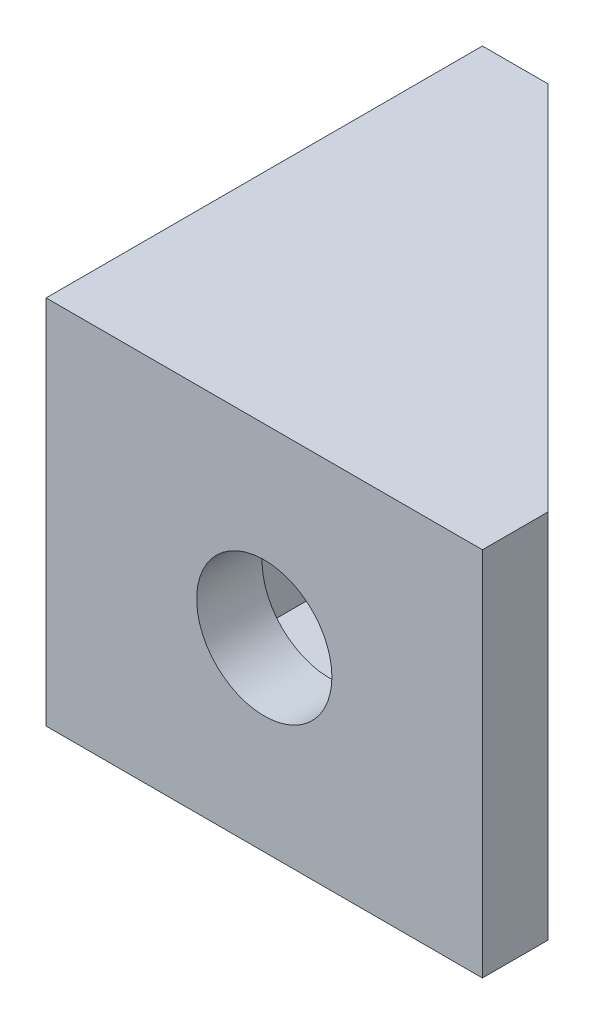
ISO-10303-21;
HEADER;
FILE_DESCRIPTION(('STEP AP214'),'2;1');
FILE_NAME('part.step','',(''),(''),'','','');
FILE_SCHEMA(('AUTOMOTIVE_DESIGN { 1 0 10303 214 1 1 1 1 }'));
ENDSEC;
DATA;
#1=APPLICATION_CONTEXT('core data for automotive mechanical design processes');
#2=APPLICATION_PROTOCOL_DEFINITION('international standard','automotive_design',2000,#1);
#3=PRODUCT_CONTEXT('',#1,'mechanical');
#4=PRODUCT('Part','Part','',(#3));
#5=PRODUCT_RELATED_PRODUCT_CATEGORY('part','',(#4));
#6=PRODUCT_DEFINITION_FORMATION('','',#4);
#7=PRODUCT_DEFINITION_CONTEXT('part definition',#1,'design');
#8=PRODUCT_DEFINITION('design','',#6,#7);
#9=PRODUCT_DEFINITION_SHAPE('','',#8);
#10=(LENGTH_UNIT() NAMED_UNIT(*) SI_UNIT(.MILLI.,.METRE.));
#11=(NAMED_UNIT(*) PLANE_ANGLE_UNIT() SI_UNIT($,.RADIAN.));
#12=(NAMED_UNIT(*) SI_UNIT($,.STERADIAN.) SOLID_ANGLE_UNIT());
#13=UNCERTAINTY_MEASURE_WITH_UNIT(LENGTH_MEASURE(1.E-05),#10,'distance_accuracy_value','');
#14=(GEOMETRIC_REPRESENTATION_CONTEXT(3) GLOBAL_UNCERTAINTY_ASSIGNED_CONTEXT((#13)) GLOBAL_UNIT_ASSIGNED_CONTEXT((#10,
#11,#12)) REPRESENTATION_CONTEXT('',''));
#15=CARTESIAN_POINT('',(0.,0.,0.));
#16=DIRECTION('',(0.,0.,1.));
#17=DIRECTION('',(1.,0.,0.));
#18=AXIS2_PLACEMENT_3D('',#15,#16,#17);
#19=CARTESIAN_POINT('',(3.,0.,-20.));
#20=DIRECTION('',(-0.707106781186544,0.,0.707106781186552));
#21=DIRECTION('',(0.707106781186551,0.,0.707106781186544));
#22=AXIS2_PLACEMENT_3D('',#19,#20,#21);
#23=PLANE('',#22);
#24=DIRECTION('',(0.,1.,0.));
#25=VECTOR('',#24,1.);
#26=CARTESIAN_POINT('',(3.,0.,-20.));
#27=LINE('',#26,#25);
#28=CARTESIAN_POINT('',(3.,0.,-20.));
#29=VERTEX_POINT('',#28);
#30=CARTESIAN_POINT('',(3.,2.,-20.));
#31=VERTEX_POINT('',#30);
#32=EDGE_CURVE('E155',#29,#31,#27,.T.);
#33=ORIENTED_EDGE('',*,*,#32,.T.);
#34=DIRECTION('',(0.707106781186551,0.,0.707106781186544));
#35=VECTOR('',#34,1.);
#36=CARTESIAN_POINT('',(3.,2.,-20.));
#37=LINE('',#36,#35);
#38=CARTESIAN_POINT('',(20.,2.,-3.));
#39=VERTEX_POINT('',#38);
#40=EDGE_CURVE('E11',#31,#39,#37,.T.);
#41=ORIENTED_EDGE('',*,*,#40,.T.);
#42=DIRECTION('',(0.,1.,0.));
#43=VECTOR('',#42,1.);
#44=CARTESIAN_POINT('',(20.,0.,-3.00000000000019));
#45=LINE('',#44,#43);
#46=CARTESIAN_POINT('',(20.,0.,-3.00000000000019));
#47=VERTEX_POINT('',#46);
#48=EDGE_CURVE('E65',#47,#39,#45,.T.);
#49=ORIENTED_EDGE('',*,*,#48,.F.);
#50=DIRECTION('',(0.707106781186551,0.,0.707106781186544));
#51=VECTOR('',#50,1.);
#52=CARTESIAN_POINT('',(3.,0.,-20.));
#53=LINE('',#52,#51);
#54=EDGE_CURVE('E144',#29,#47,#53,.T.);
#55=ORIENTED_EDGE('',*,*,#54,.F.);
#56=EDGE_LOOP('',(#33,#41,#49,#55));
#57=FACE_BOUND('',#56,.T.);
#58=ADVANCED_FACE('F42',(#57),#23,.F.);
#59=CARTESIAN_POINT('',(0.,17.,0.));
#60=DIRECTION('',(1.,0.,0.));
#61=DIRECTION('',(0.,0.,-1.));
#62=AXIS2_PLACEMENT_3D('',#59,#60,#61);
#63=PLANE('',#62);
#64=CARTESIAN_POINT('',(0.,8.5,-10.));
#65=DIRECTION('',(-1.,0.,0.));
#66=DIRECTION('',(0.,0.,1.));
#67=AXIS2_PLACEMENT_3D('',#64,#65,#66);
#68=CIRCLE('',#67,3.1);
#69=CARTESIAN_POINT('',(0.,8.5,-6.9));
#70=VERTEX_POINT('',#69);
#71=EDGE_CURVE('E238',#70,#70,#68,.T.);
#72=ORIENTED_EDGE('',*,*,#71,.F.);
#73=EDGE_LOOP('',(#72));
#74=FACE_BOUND('',#73,.T.);
#75=DIRECTION('',(0.,0.,1.));
#76=VECTOR('',#75,1.);
#77=CARTESIAN_POINT('',(0.,0.,0.));
#78=LINE('',#77,#76);
#79=CARTESIAN_POINT('',(0.,0.,-20.));
#80=VERTEX_POINT('',#79);
#81=CARTESIAN_POINT('',(0.,0.,0.));
#82=VERTEX_POINT('',#81);
#83=EDGE_CURVE('E153',#80,#82,#78,.T.);
#84=ORIENTED_EDGE('',*,*,#83,.T.);
#85=DIRECTION('',(0.,-1.,0.));
#86=VECTOR('',#85,1.);
#87=CARTESIAN_POINT('',(0.,17.,0.));
#88=LINE('',#87,#86);
#89=CARTESIAN_POINT('',(0.,17.,0.));
#90=VERTEX_POINT('',#89);
#91=EDGE_CURVE('E194',#90,#82,#88,.T.);
#92=ORIENTED_EDGE('',*,*,#91,.F.);
#93=DIRECTION('',(0.,0.,1.));
#94=VECTOR('',#93,1.);
#95=CARTESIAN_POINT('',(0.,17.,0.));
#96=LINE('',#95,#94);
#97=CARTESIAN_POINT('',(0.,17.,-20.));
#98=VERTEX_POINT('',#97);
#99=EDGE_CURVE('E159',#98,#90,#96,.T.);
#100=ORIENTED_EDGE('',*,*,#99,.F.);
#101=DIRECTION('',(0.,-1.,0.));
#102=VECTOR('',#101,1.);
#103=CARTESIAN_POINT('',(0.,17.,-20.));
#104=LINE('',#103,#102);
#105=EDGE_CURVE('E174',#98,#80,#104,.T.);
#106=ORIENTED_EDGE('',*,*,#105,.T.);
#107=EDGE_LOOP('',(#84,#92,#100,#106));
#108=FACE_BOUND('',#107,.T.);
#109=ADVANCED_FACE('F44',(#74,#108),#63,.F.);
#110=CARTESIAN_POINT('',(0.,17.,0.));
#111=DIRECTION('',(0.,0.,-1.));
#112=DIRECTION('',(-1.,0.,0.));
#113=AXIS2_PLACEMENT_3D('',#110,#111,#112);
#114=PLANE('',#113);
#115=CARTESIAN_POINT('',(10.,8.5,0.));
#116=DIRECTION('',(0.,0.,1.));
#117=DIRECTION('',(1.,0.,0.));
#118=AXIS2_PLACEMENT_3D('',#115,#116,#117);
#119=CIRCLE('',#118,3.1);
#120=CARTESIAN_POINT('',(13.1,8.5,0.));
#121=VERTEX_POINT('',#120);
#122=EDGE_CURVE('E246',#121,#121,#119,.T.);
#123=ORIENTED_EDGE('',*,*,#122,.F.);
#124=EDGE_LOOP('',(#123));
#125=FACE_BOUND('',#124,.T.);
#126=DIRECTION('',(1.,0.,0.));
#127=VECTOR('',#126,1.);
#128=CARTESIAN_POINT('',(0.,0.,0.));
#129=LINE('',#128,#127);
#130=CARTESIAN_POINT('',(20.,0.,0.));
#131=VERTEX_POINT('',#130);
#132=EDGE_CURVE('E178',#82,#131,#129,.T.);
#133=ORIENTED_EDGE('',*,*,#132,.T.);
#134=DIRECTION('',(0.,-1.,0.));
#135=VECTOR('',#134,1.);
#136=CARTESIAN_POINT('',(20.,17.,0.));
#137=LINE('',#136,#135);
#138=CARTESIAN_POINT('',(20.,17.,0.));
#139=VERTEX_POINT('',#138);
#140=EDGE_CURVE('E190',#139,#131,#137,.T.);
#141=ORIENTED_EDGE('',*,*,#140,.F.);
#142=DIRECTION('',(1.,0.,0.));
#143=VECTOR('',#142,1.);
#144=CARTESIAN_POINT('',(0.,17.,0.));
#145=LINE('',#144,#143);
#146=EDGE_CURVE('E163',#90,#139,#145,.T.);
#147=ORIENTED_EDGE('',*,*,#146,.F.);
#148=ORIENTED_EDGE('',*,*,#91,.T.);
#149=EDGE_LOOP('',(#133,#141,#147,#148));
#150=FACE_BOUND('',#149,.T.);
#151=ADVANCED_FACE('F219',(#125,#150),#114,.F.);
#152=CARTESIAN_POINT('',(20.,17.,0.));
#153=DIRECTION('',(-1.,0.,0.));
#154=DIRECTION('',(0.,0.,1.));
#155=AXIS2_PLACEMENT_3D('',#152,#153,#154);
#156=PLANE('',#155);
#157=DIRECTION('',(0.,0.,-1.));
#158=VECTOR('',#157,1.);
#159=CARTESIAN_POINT('',(20.,0.,0.));
#160=LINE('',#159,#158);
#161=EDGE_CURVE('E181',#131,#47,#160,.T.);
#162=ORIENTED_EDGE('',*,*,#161,.T.);
#163=ORIENTED_EDGE('',*,*,#48,.T.);
#164=DIRECTION('',(0.,-1.,0.));
#165=VECTOR('',#164,1.);
#166=CARTESIAN_POINT('',(20.,15.,-3.));
#167=LINE('',#166,#165);
#168=CARTESIAN_POINT('',(20.,15.,-3.));
#169=VERTEX_POINT('',#168);
#170=EDGE_CURVE('E125',#169,#39,#167,.T.);
#171=ORIENTED_EDGE('',*,*,#170,.F.);
#172=CARTESIAN_POINT('',(20.,17.,-3.00000000000019));
#173=VERTEX_POINT('',#172);
#174=EDGE_CURVE('E154',#169,#173,#45,.T.);
#175=ORIENTED_EDGE('',*,*,#174,.T.);
#176=DIRECTION('',(0.,0.,-1.));
#177=VECTOR('',#176,1.);
#178=CARTESIAN_POINT('',(20.,17.,0.));
#179=LINE('',#178,#177);
#180=EDGE_CURVE('E167',#139,#173,#179,.T.);
#181=ORIENTED_EDGE('',*,*,#180,.F.);
#182=ORIENTED_EDGE('',*,*,#140,.T.);
#183=EDGE_LOOP('',(#162,#163,#171,#175,#181,#182));
#184=FACE_BOUND('',#183,.T.);
#185=ADVANCED_FACE('F212',(#184),#156,.F.);
#186=CARTESIAN_POINT('',(0.,17.,-20.));
#187=DIRECTION('',(0.,0.,1.));
#188=DIRECTION('',(1.,0.,0.));
#189=AXIS2_PLACEMENT_3D('',#186,#187,#188);
#190=PLANE('',#189);
#191=DIRECTION('',(-1.,0.,0.));
#192=VECTOR('',#191,1.);
#193=CARTESIAN_POINT('',(0.,17.,-20.));
#194=LINE('',#193,#192);
#195=CARTESIAN_POINT('',(3.,17.,-20.));
#196=VERTEX_POINT('',#195);
#197=EDGE_CURVE('E171',#196,#98,#194,.T.);
#198=ORIENTED_EDGE('',*,*,#197,.F.);
#199=CARTESIAN_POINT('',(3.,15.,-20.));
#200=VERTEX_POINT('',#199);
#201=EDGE_CURVE('E147',#200,#196,#27,.T.);
#202=ORIENTED_EDGE('',*,*,#201,.F.);
#203=DIRECTION('',(0.,1.,0.));
#204=VECTOR('',#203,1.);
#205=CARTESIAN_POINT('',(3.,15.,-20.));
#206=LINE('',#205,#204);
#207=EDGE_CURVE('E113',#31,#200,#206,.T.);
#208=ORIENTED_EDGE('',*,*,#207,.F.);
#209=ORIENTED_EDGE('',*,*,#32,.F.);
#210=DIRECTION('',(-1.,0.,0.));
#211=VECTOR('',#210,1.);
#212=CARTESIAN_POINT('',(0.,0.,-20.));
#213=LINE('',#212,#211);
#214=EDGE_CURVE('E164',#29,#80,#213,.T.);
#215=ORIENTED_EDGE('',*,*,#214,.T.);
#216=ORIENTED_EDGE('',*,*,#105,.F.);
#217=EDGE_LOOP('',(#198,#202,#208,#209,#215,#216));
#218=FACE_BOUND('',#217,.T.);
#219=ADVANCED_FACE('F205',(#218),#190,.F.);
#220=CARTESIAN_POINT('',(0.,17.,0.));
#221=DIRECTION('',(0.,-1.,0.));
#222=DIRECTION('',(0.,0.,-1.));
#223=AXIS2_PLACEMENT_3D('',#220,#221,#222);
#224=PLANE('',#223);
#225=ORIENTED_EDGE('',*,*,#180,.T.);
#226=DIRECTION('',(0.707106781186551,0.,0.707106781186544));
#227=VECTOR('',#226,1.);
#228=CARTESIAN_POINT('',(3.,17.,-20.));
#229=LINE('',#228,#227);
#230=EDGE_CURVE('E142',#196,#173,#229,.T.);
#231=ORIENTED_EDGE('',*,*,#230,.F.);
#232=ORIENTED_EDGE('',*,*,#197,.T.);
#233=ORIENTED_EDGE('',*,*,#99,.T.);
#234=ORIENTED_EDGE('',*,*,#146,.T.);
#235=EDGE_LOOP('',(#225,#231,#232,#233,#234));
#236=FACE_BOUND('',#235,.T.);
#237=ADVANCED_FACE('F214',(#236),#224,.F.);
#238=CARTESIAN_POINT('',(0.,0.,0.));
#239=DIRECTION('',(0.,-1.,0.));
#240=DIRECTION('',(0.,0.,-1.));
#241=AXIS2_PLACEMENT_3D('',#238,#239,#240);
#242=PLANE('',#241);
#243=ORIENTED_EDGE('',*,*,#54,.T.);
#244=ORIENTED_EDGE('',*,*,#161,.F.);
#245=ORIENTED_EDGE('',*,*,#132,.F.);
#246=ORIENTED_EDGE('',*,*,#83,.F.);
#247=ORIENTED_EDGE('',*,*,#214,.F.);
#248=EDGE_LOOP('',(#243,#244,#245,#246,#247));
#249=FACE_BOUND('',#248,.T.);
#250=ADVANCED_FACE('F222',(#249),#242,.T.);
#251=ORIENTED_EDGE('',*,*,#174,.F.);
#252=DIRECTION('',(-0.707106781186551,0.,-0.707106781186544));
#253=VECTOR('',#252,1.);
#254=CARTESIAN_POINT('',(3.,15.,-20.));
#255=LINE('',#254,#253);
#256=EDGE_CURVE('E51',#169,#200,#255,.T.);
#257=ORIENTED_EDGE('',*,*,#256,.T.);
#258=ORIENTED_EDGE('',*,*,#201,.T.);
#259=ORIENTED_EDGE('',*,*,#230,.T.);
#260=EDGE_LOOP('',(#251,#257,#258,#259));
#261=FACE_BOUND('',#260,.T.);
#262=ADVANCED_FACE('F200',(#261),#23,.F.);
#263=CARTESIAN_POINT('',(3.,2.,-3.));
#264=DIRECTION('',(0.,-1.,0.));
#265=DIRECTION('',(0.,0.,-1.));
#266=AXIS2_PLACEMENT_3D('',#263,#264,#265);
#267=PLANE('',#266);
#268=DIRECTION('',(0.,0.,-1.));
#269=VECTOR('',#268,1.);
#270=CARTESIAN_POINT('',(3.,2.,-3.));
#271=LINE('',#270,#269);
#272=CARTESIAN_POINT('',(3.,2.,-3.));
#273=VERTEX_POINT('',#272);
#274=EDGE_CURVE('E58',#273,#31,#271,.T.);
#275=ORIENTED_EDGE('',*,*,#274,.F.);
#276=DIRECTION('',(-1.,0.,0.));
#277=VECTOR('',#276,1.);
#278=CARTESIAN_POINT('',(3.,2.,-3.));
#279=LINE('',#278,#277);
#280=EDGE_CURVE('E117',#39,#273,#279,.T.);
#281=ORIENTED_EDGE('',*,*,#280,.F.);
#282=ORIENTED_EDGE('',*,*,#40,.F.);
#283=EDGE_LOOP('',(#275,#281,#282));
#284=FACE_BOUND('',#283,.T.);
#285=ADVANCED_FACE('F270',(#284),#267,.F.);
#286=CARTESIAN_POINT('',(3.,15.,-3.));
#287=DIRECTION('',(0.,1.,0.));
#288=DIRECTION('',(0.,0.,1.));
#289=AXIS2_PLACEMENT_3D('',#286,#287,#288);
#290=PLANE('',#289);
#291=DIRECTION('',(1.,0.,0.));
#292=VECTOR('',#291,1.);
#293=CARTESIAN_POINT('',(3.,15.,-3.));
#294=LINE('',#293,#292);
#295=CARTESIAN_POINT('',(3.,15.,-3.));
#296=VERTEX_POINT('',#295);
#297=EDGE_CURVE('E120',#296,#169,#294,.T.);
#298=ORIENTED_EDGE('',*,*,#297,.F.);
#299=DIRECTION('',(0.,0.,-1.));
#300=VECTOR('',#299,1.);
#301=CARTESIAN_POINT('',(3.,15.,-3.));
#302=LINE('',#301,#300);
#303=EDGE_CURVE('E106',#296,#200,#302,.T.);
#304=ORIENTED_EDGE('',*,*,#303,.T.);
#305=ORIENTED_EDGE('',*,*,#256,.F.);
#306=EDGE_LOOP('',(#298,#304,#305));
#307=FACE_BOUND('',#306,.T.);
#308=ADVANCED_FACE('F121',(#307),#290,.F.);
#309=CARTESIAN_POINT('',(3.,15.,-3.));
#310=DIRECTION('',(-1.,0.,0.));
#311=DIRECTION('',(0.,0.,1.));
#312=AXIS2_PLACEMENT_3D('',#309,#310,#311);
#313=PLANE('',#312);
#314=CARTESIAN_POINT('',(3.,8.5,-10.));
#315=DIRECTION('',(-1.,0.,0.));
#316=DIRECTION('',(0.,0.,1.));
#317=AXIS2_PLACEMENT_3D('',#314,#315,#316);
#318=CIRCLE('',#317,3.1);
#319=CARTESIAN_POINT('',(3.,8.5,-6.9));
#320=VERTEX_POINT('',#319);
#321=EDGE_CURVE('E132',#320,#320,#318,.F.);
#322=ORIENTED_EDGE('',*,*,#321,.F.);
#323=EDGE_LOOP('',(#322));
#324=FACE_BOUND('',#323,.T.);
#325=ORIENTED_EDGE('',*,*,#207,.T.);
#326=ORIENTED_EDGE('',*,*,#303,.F.);
#327=DIRECTION('',(0.,1.,0.));
#328=VECTOR('',#327,1.);
#329=CARTESIAN_POINT('',(3.,15.,-3.));
#330=LINE('',#329,#328);
#331=EDGE_CURVE('E110',#273,#296,#330,.T.);
#332=ORIENTED_EDGE('',*,*,#331,.F.);
#333=ORIENTED_EDGE('',*,*,#274,.T.);
#334=EDGE_LOOP('',(#325,#326,#332,#333));
#335=FACE_BOUND('',#334,.T.);
#336=ADVANCED_FACE('F108',(#324,#335),#313,.F.);
#337=CARTESIAN_POINT('',(0.,0.,-3.));
#338=DIRECTION('',(0.,0.,1.));
#339=DIRECTION('',(1.,0.,0.));
#340=AXIS2_PLACEMENT_3D('',#337,#338,#339);
#341=PLANE('',#340);
#342=CARTESIAN_POINT('',(10.,8.5,-3.));
#343=DIRECTION('',(0.,0.,1.));
#344=DIRECTION('',(1.,0.,0.));
#345=AXIS2_PLACEMENT_3D('',#342,#343,#344);
#346=CIRCLE('',#345,3.1);
#347=CARTESIAN_POINT('',(13.1,8.5,-3.));
#348=VERTEX_POINT('',#347);
#349=EDGE_CURVE('E241',#348,#348,#346,.F.);
#350=ORIENTED_EDGE('',*,*,#349,.F.);
#351=EDGE_LOOP('',(#350));
#352=FACE_BOUND('',#351,.T.);
#353=ORIENTED_EDGE('',*,*,#331,.T.);
#354=ORIENTED_EDGE('',*,*,#297,.T.);
#355=ORIENTED_EDGE('',*,*,#170,.T.);
#356=ORIENTED_EDGE('',*,*,#280,.T.);
#357=EDGE_LOOP('',(#353,#354,#355,#356));
#358=FACE_BOUND('',#357,.T.);
#359=ADVANCED_FACE('F127',(#352,#358),#341,.F.);
#360=CARTESIAN_POINT('',(20.001,8.5,-10.));
#361=DIRECTION('',(-1.,0.,0.));
#362=DIRECTION('',(0.,0.,1.));
#363=AXIS2_PLACEMENT_3D('',#360,#361,#362);
#364=CYLINDRICAL_SURFACE('',#363,3.1);
#365=CARTESIAN_POINT('',(0.,8.5,-6.9));
#366=CARTESIAN_POINT('',(0.0312500000000035,8.5,-6.9));
#367=CARTESIAN_POINT('',(0.0625000000000035,8.5,-6.9));
#368=CARTESIAN_POINT('',(0.125000000000004,8.5,-6.9));
#369=CARTESIAN_POINT('',(0.156250000000004,8.5,-6.9));
#370=CARTESIAN_POINT('',(0.218750000000004,8.5,-6.9));
#371=CARTESIAN_POINT('',(0.250000000000004,8.5,-6.9));
#372=CARTESIAN_POINT('',(0.312500000000004,8.5,-6.9));
#373=CARTESIAN_POINT('',(0.343750000000004,8.5,-6.9));
#374=CARTESIAN_POINT('',(0.406250000000004,8.5,-6.9));
#375=CARTESIAN_POINT('',(0.437500000000004,8.5,-6.9));
#376=CARTESIAN_POINT('',(0.500000000000004,8.5,-6.9));
#377=CARTESIAN_POINT('',(0.531250000000004,8.5,-6.9));
#378=CARTESIAN_POINT('',(0.593750000000004,8.5,-6.9));
#379=CARTESIAN_POINT('',(0.625000000000004,8.5,-6.9));
#380=CARTESIAN_POINT('',(0.687500000000004,8.5,-6.9));
#381=CARTESIAN_POINT('',(0.718750000000004,8.5,-6.9));
#382=CARTESIAN_POINT('',(0.781250000000003,8.5,-6.9));
#383=CARTESIAN_POINT('',(0.812500000000002,8.5,-6.9));
#384=CARTESIAN_POINT('',(0.875000000000001,8.5,-6.9));
#385=CARTESIAN_POINT('',(0.906250000000001,8.5,-6.9));
#386=CARTESIAN_POINT('',(0.968750000000001,8.5,-6.9));
#387=CARTESIAN_POINT('',(1.,8.5,-6.9));
#388=CARTESIAN_POINT('',(1.0625,8.5,-6.9));
#389=CARTESIAN_POINT('',(1.09375,8.5,-6.9));
#390=CARTESIAN_POINT('',(1.15625,8.5,-6.9));
#391=CARTESIAN_POINT('',(1.1875,8.5,-6.9));
#392=CARTESIAN_POINT('',(1.25,8.5,-6.9));
#393=CARTESIAN_POINT('',(1.28125,8.5,-6.9));
#394=CARTESIAN_POINT('',(1.34375,8.5,-6.9));
#395=CARTESIAN_POINT('',(1.375,8.5,-6.9));
#396=CARTESIAN_POINT('',(1.4375,8.5,-6.9));
#397=CARTESIAN_POINT('',(1.46875,8.5,-6.9));
#398=CARTESIAN_POINT('',(1.53125,8.5,-6.9));
#399=CARTESIAN_POINT('',(1.5625,8.5,-6.9));
#400=CARTESIAN_POINT('',(1.625,8.5,-6.9));
#401=CARTESIAN_POINT('',(1.65625,8.5,-6.9));
#402=CARTESIAN_POINT('',(1.71875,8.5,-6.9));
#403=CARTESIAN_POINT('',(1.75,8.5,-6.9));
#404=CARTESIAN_POINT('',(1.8125,8.5,-6.9));
#405=CARTESIAN_POINT('',(1.84375,8.5,-6.9));
#406=CARTESIAN_POINT('',(1.90625,8.5,-6.9));
#407=CARTESIAN_POINT('',(1.9375,8.5,-6.9));
#408=CARTESIAN_POINT('',(2.,8.5,-6.9));
#409=CARTESIAN_POINT('',(2.03125,8.5,-6.9));
#410=CARTESIAN_POINT('',(2.09375,8.5,-6.9));
#411=CARTESIAN_POINT('',(2.125,8.5,-6.9));
#412=CARTESIAN_POINT('',(2.1875,8.5,-6.9));
#413=CARTESIAN_POINT('',(2.21875,8.5,-6.9));
#414=CARTESIAN_POINT('',(2.28125,8.5,-6.9));
#415=CARTESIAN_POINT('',(2.3125,8.5,-6.9));
#416=CARTESIAN_POINT('',(2.375,8.5,-6.9));
#417=CARTESIAN_POINT('',(2.40625,8.5,-6.9));
#418=CARTESIAN_POINT('',(2.46875,8.5,-6.9));
#419=CARTESIAN_POINT('',(2.5,8.5,-6.9));
#420=CARTESIAN_POINT('',(2.5625,8.5,-6.9));
#421=CARTESIAN_POINT('',(2.59375,8.5,-6.9));
#422=CARTESIAN_POINT('',(2.65625,8.5,-6.9));
#423=CARTESIAN_POINT('',(2.6875,8.5,-6.9));
#424=CARTESIAN_POINT('',(2.75,8.5,-6.9));
#425=CARTESIAN_POINT('',(2.78125,8.5,-6.9));
#426=CARTESIAN_POINT('',(2.84375,8.5,-6.9));
#427=CARTESIAN_POINT('',(2.875,8.5,-6.9));
#428=CARTESIAN_POINT('',(2.9375,8.5,-6.9));
#429=CARTESIAN_POINT('',(2.96875,8.5,-6.9));
#430=CARTESIAN_POINT('',(3.,8.5,-6.9));
#431=B_SPLINE_CURVE_WITH_KNOTS('',3,(#365,#366,#367,#368,#369,#370,#371,#372,#373,#374,#375,
#376,#377,#378,#379,#380,#381,#382,#383,#384,#385,#386,#387,#388,#389,#390,#391,#392,#393,#394,
#395,#396,#397,#398,#399,#400,#401,#402,#403,#404,#405,#406,#407,#408,#409,#410,#411,#412,#413,
#414,#415,#416,#417,#418,#419,#420,#421,#422,#423,#424,#425,#426,#427,#428,#429,#430),
.UNSPECIFIED.,.F.,.F.,(4,2,2,2,2,2,2,2,2,2,2,2,2,2,2,2,2,2,2,2,2,2,2,2,2,2,2,2,2,2,2,2,4),(0.,
0.0937500000000001,0.1875,0.28125,0.375,0.46875,0.5625,0.656250000000001,0.750000000000001,
0.843749999999997,0.937499999999997,1.03125,1.125,1.21875,1.3125,1.40625,1.5,1.59375,1.6875,
1.78125,1.875,1.96875,2.0625,2.15625,2.25,2.34375,2.4375,2.53125,2.625,2.71875,2.8125,2.90625,
3.),.UNSPECIFIED.);
#432=EDGE_CURVE('BSEAM256',#70,#320,#431,.T.);
#433=ORIENTED_EDGE('',*,*,#71,.T.);
#434=ORIENTED_EDGE('',*,*,#321,.T.);
#435=ORIENTED_EDGE('',*,*,#432,.T.);
#436=ORIENTED_EDGE('',*,*,#432,.F.);
#437=EDGE_LOOP('',(#433,#435,#434,#436));
#438=FACE_BOUND('',#437,.T.);
#439=ADVANCED_FACE('F256',(#438),#364,.F.);
#440=CARTESIAN_POINT('',(10.,8.5,-20.001));
#441=DIRECTION('',(0.,0.,1.));
#442=DIRECTION('',(1.,0.,0.));
#443=AXIS2_PLACEMENT_3D('',#440,#441,#442);
#444=CYLINDRICAL_SURFACE('',#443,3.1);
#445=ORIENTED_EDGE('',*,*,#122,.T.);
#446=EDGE_LOOP('',(#445));
#447=FACE_BOUND('',#446,.T.);
#448=ORIENTED_EDGE('',*,*,#349,.T.);
#449=EDGE_LOOP('',(#448));
#450=FACE_BOUND('',#449,.T.);
#451=ADVANCED_FACE('F253',(#447,#450),#444,.F.);
#452=CLOSED_SHELL('',(#58,#109,#151,#185,#219,#237,#250,#262,#285,#308,#336,#359,#439,#451));
#453=MANIFOLD_SOLID_BREP('B2',#452);
#454=ADVANCED_BREP_SHAPE_REPRESENTATION('',(#18,#453),#14);
#455=SHAPE_DEFINITION_REPRESENTATION(#9,#454);
ENDSEC;
END-ISO-10303-21;
